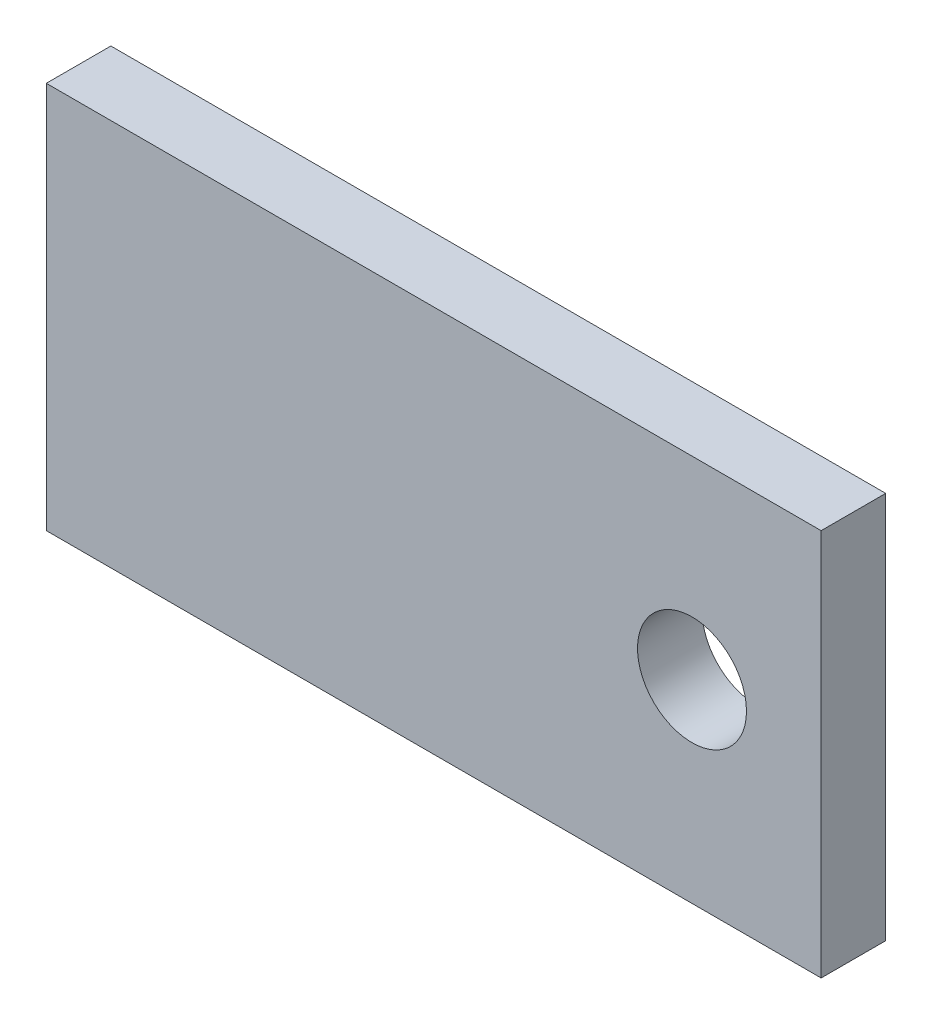
ISO-10303-21;
HEADER;
FILE_DESCRIPTION(('STEP AP214'),'2;1');
FILE_NAME('part.step','',(''),(''),'','','');
FILE_SCHEMA(('AUTOMOTIVE_DESIGN { 1 0 10303 214 1 1 1 1 }'));
ENDSEC;
DATA;
#1=APPLICATION_CONTEXT('core data for automotive mechanical design processes');
#2=APPLICATION_PROTOCOL_DEFINITION('international standard','automotive_design',2000,#1);
#3=PRODUCT_CONTEXT('',#1,'mechanical');
#4=PRODUCT('Part','Part','',(#3));
#5=PRODUCT_RELATED_PRODUCT_CATEGORY('part','',(#4));
#6=PRODUCT_DEFINITION_FORMATION('','',#4);
#7=PRODUCT_DEFINITION_CONTEXT('part definition',#1,'design');
#8=PRODUCT_DEFINITION('design','',#6,#7);
#9=PRODUCT_DEFINITION_SHAPE('','',#8);
#10=(LENGTH_UNIT() NAMED_UNIT(*) SI_UNIT(.MILLI.,.METRE.));
#11=(NAMED_UNIT(*) PLANE_ANGLE_UNIT() SI_UNIT($,.RADIAN.));
#12=(NAMED_UNIT(*) SI_UNIT($,.STERADIAN.) SOLID_ANGLE_UNIT());
#13=UNCERTAINTY_MEASURE_WITH_UNIT(LENGTH_MEASURE(1.E-05),#10,'distance_accuracy_value','');
#14=(GEOMETRIC_REPRESENTATION_CONTEXT(3) GLOBAL_UNCERTAINTY_ASSIGNED_CONTEXT((#13)) GLOBAL_UNIT_ASSIGNED_CONTEXT((#10,
#11,#12)) REPRESENTATION_CONTEXT('',''));
#15=CARTESIAN_POINT('',(0.,0.,0.));
#16=DIRECTION('',(0.,0.,1.));
#17=DIRECTION('',(1.,0.,0.));
#18=AXIS2_PLACEMENT_3D('',#15,#16,#17);
#19=CARTESIAN_POINT('',(38.1,-19.05,3.175));
#20=DIRECTION('',(-1.,0.,0.));
#21=DIRECTION('',(0.,0.,1.));
#22=AXIS2_PLACEMENT_3D('',#19,#20,#21);
#23=PLANE('',#22);
#24=DIRECTION('',(0.,1.,0.));
#25=VECTOR('',#24,1.);
#26=CARTESIAN_POINT('',(38.1,-19.05,-3.175));
#27=LINE('',#26,#25);
#28=CARTESIAN_POINT('',(38.1,-19.05,-3.175));
#29=VERTEX_POINT('',#28);
#30=CARTESIAN_POINT('',(38.1,19.05,-3.175));
#31=VERTEX_POINT('',#30);
#32=EDGE_CURVE('E102',#29,#31,#27,.T.);
#33=ORIENTED_EDGE('',*,*,#32,.T.);
#34=DIRECTION('',(0.,0.,-1.));
#35=VECTOR('',#34,1.);
#36=CARTESIAN_POINT('',(38.1,19.05,3.175));
#37=LINE('',#36,#35);
#38=CARTESIAN_POINT('',(38.1,19.05,3.175));
#39=VERTEX_POINT('',#38);
#40=EDGE_CURVE('E11',#39,#31,#37,.T.);
#41=ORIENTED_EDGE('',*,*,#40,.F.);
#42=DIRECTION('',(0.,1.,0.));
#43=VECTOR('',#42,1.);
#44=CARTESIAN_POINT('',(38.1,-19.05,3.175));
#45=LINE('',#44,#43);
#46=CARTESIAN_POINT('',(38.1,-19.05,3.175));
#47=VERTEX_POINT('',#46);
#48=EDGE_CURVE('E90',#47,#39,#45,.T.);
#49=ORIENTED_EDGE('',*,*,#48,.F.);
#50=DIRECTION('',(0.,0.,-1.));
#51=VECTOR('',#50,1.);
#52=CARTESIAN_POINT('',(38.1,-19.05,3.175));
#53=LINE('',#52,#51);
#54=EDGE_CURVE('E98',#47,#29,#53,.T.);
#55=ORIENTED_EDGE('',*,*,#54,.T.);
#56=EDGE_LOOP('',(#33,#41,#49,#55));
#57=FACE_BOUND('',#56,.T.);
#58=ADVANCED_FACE('F39',(#57),#23,.F.);
#59=CARTESIAN_POINT('',(-38.1,19.05,3.175));
#60=DIRECTION('',(0.,-1.,0.));
#61=DIRECTION('',(0.,0.,-1.));
#62=AXIS2_PLACEMENT_3D('',#59,#60,#61);
#63=PLANE('',#62);
#64=DIRECTION('',(-1.,0.,0.));
#65=VECTOR('',#64,1.);
#66=CARTESIAN_POINT('',(-38.1,19.05,-3.175));
#67=LINE('',#66,#65);
#68=CARTESIAN_POINT('',(-38.1,19.05,-3.175));
#69=VERTEX_POINT('',#68);
#70=EDGE_CURVE('E94',#31,#69,#67,.T.);
#71=ORIENTED_EDGE('',*,*,#70,.T.);
#72=DIRECTION('',(0.,0.,-1.));
#73=VECTOR('',#72,1.);
#74=CARTESIAN_POINT('',(-38.1,19.05,3.175));
#75=LINE('',#74,#73);
#76=CARTESIAN_POINT('',(-38.1,19.05,3.175));
#77=VERTEX_POINT('',#76);
#78=EDGE_CURVE('E47',#77,#69,#75,.T.);
#79=ORIENTED_EDGE('',*,*,#78,.F.);
#80=DIRECTION('',(-1.,0.,0.));
#81=VECTOR('',#80,1.);
#82=CARTESIAN_POINT('',(-38.1,19.05,3.175));
#83=LINE('',#82,#81);
#84=EDGE_CURVE('E85',#39,#77,#83,.T.);
#85=ORIENTED_EDGE('',*,*,#84,.F.);
#86=ORIENTED_EDGE('',*,*,#40,.T.);
#87=EDGE_LOOP('',(#71,#79,#85,#86));
#88=FACE_BOUND('',#87,.T.);
#89=ADVANCED_FACE('F93',(#88),#63,.F.);
#90=CARTESIAN_POINT('',(-38.1,-19.05,3.175));
#91=DIRECTION('',(1.,0.,0.));
#92=DIRECTION('',(0.,0.,-1.));
#93=AXIS2_PLACEMENT_3D('',#90,#91,#92);
#94=PLANE('',#93);
#95=DIRECTION('',(0.,-1.,0.));
#96=VECTOR('',#95,1.);
#97=CARTESIAN_POINT('',(-38.1,-19.05,-3.175));
#98=LINE('',#97,#96);
#99=CARTESIAN_POINT('',(-38.1,-19.05,-3.175));
#100=VERTEX_POINT('',#99);
#101=EDGE_CURVE('E72',#69,#100,#98,.T.);
#102=ORIENTED_EDGE('',*,*,#101,.T.);
#103=DIRECTION('',(0.,0.,-1.));
#104=VECTOR('',#103,1.);
#105=CARTESIAN_POINT('',(-38.1,-19.05,3.175));
#106=LINE('',#105,#104);
#107=CARTESIAN_POINT('',(-38.1,-19.05,3.175));
#108=VERTEX_POINT('',#107);
#109=EDGE_CURVE('E95',#108,#100,#106,.T.);
#110=ORIENTED_EDGE('',*,*,#109,.F.);
#111=DIRECTION('',(0.,-1.,0.));
#112=VECTOR('',#111,1.);
#113=CARTESIAN_POINT('',(-38.1,-19.05,3.175));
#114=LINE('',#113,#112);
#115=EDGE_CURVE('E88',#77,#108,#114,.T.);
#116=ORIENTED_EDGE('',*,*,#115,.F.);
#117=ORIENTED_EDGE('',*,*,#78,.T.);
#118=EDGE_LOOP('',(#102,#110,#116,#117));
#119=FACE_BOUND('',#118,.T.);
#120=ADVANCED_FACE('F96',(#119),#94,.F.);
#121=CARTESIAN_POINT('',(-38.1,-19.05,3.175));
#122=DIRECTION('',(0.,1.,0.));
#123=DIRECTION('',(0.,0.,1.));
#124=AXIS2_PLACEMENT_3D('',#121,#122,#123);
#125=PLANE('',#124);
#126=DIRECTION('',(1.,0.,0.));
#127=VECTOR('',#126,1.);
#128=CARTESIAN_POINT('',(-38.1,-19.05,-3.175));
#129=LINE('',#128,#127);
#130=EDGE_CURVE('E78',#100,#29,#129,.T.);
#131=ORIENTED_EDGE('',*,*,#130,.T.);
#132=ORIENTED_EDGE('',*,*,#54,.F.);
#133=DIRECTION('',(1.,0.,0.));
#134=VECTOR('',#133,1.);
#135=CARTESIAN_POINT('',(-38.1,-19.05,3.175));
#136=LINE('',#135,#134);
#137=EDGE_CURVE('E55',#108,#47,#136,.T.);
#138=ORIENTED_EDGE('',*,*,#137,.F.);
#139=ORIENTED_EDGE('',*,*,#109,.T.);
#140=EDGE_LOOP('',(#131,#132,#138,#139));
#141=FACE_BOUND('',#140,.T.);
#142=ADVANCED_FACE('F110',(#141),#125,.F.);
#143=CARTESIAN_POINT('',(38.1,19.05,3.175));
#144=DIRECTION('',(0.,0.,-1.));
#145=DIRECTION('',(-1.,0.,0.));
#146=AXIS2_PLACEMENT_3D('',#143,#144,#145);
#147=PLANE('',#146);
#148=CARTESIAN_POINT('',(25.4,0.,3.175));
#149=DIRECTION('',(0.,0.,1.));
#150=DIRECTION('',(1.,0.,0.));
#151=AXIS2_PLACEMENT_3D('',#148,#149,#150);
#152=CIRCLE('',#151,5.357876);
#153=CARTESIAN_POINT('',(30.757876,0.,3.175));
#154=VERTEX_POINT('',#153);
#155=EDGE_CURVE('E118',#154,#154,#152,.T.);
#156=ORIENTED_EDGE('',*,*,#155,.F.);
#157=EDGE_LOOP('',(#156));
#158=FACE_BOUND('',#157,.T.);
#159=ORIENTED_EDGE('',*,*,#48,.T.);
#160=ORIENTED_EDGE('',*,*,#84,.T.);
#161=ORIENTED_EDGE('',*,*,#115,.T.);
#162=ORIENTED_EDGE('',*,*,#137,.T.);
#163=EDGE_LOOP('',(#159,#160,#161,#162));
#164=FACE_BOUND('',#163,.T.);
#165=ADVANCED_FACE('F86',(#158,#164),#147,.F.);
#166=CARTESIAN_POINT('',(38.1,19.05,-3.175));
#167=DIRECTION('',(0.,0.,-1.));
#168=DIRECTION('',(-1.,0.,0.));
#169=AXIS2_PLACEMENT_3D('',#166,#167,#168);
#170=PLANE('',#169);
#171=CARTESIAN_POINT('',(25.4,0.,-3.175));
#172=DIRECTION('',(0.,0.,1.));
#173=DIRECTION('',(1.,0.,0.));
#174=AXIS2_PLACEMENT_3D('',#171,#172,#173);
#175=CIRCLE('',#174,5.357876);
#176=CARTESIAN_POINT('',(30.757876,0.,-3.175));
#177=VERTEX_POINT('',#176);
#178=EDGE_CURVE('E105',#177,#177,#175,.T.);
#179=ORIENTED_EDGE('',*,*,#178,.T.);
#180=EDGE_LOOP('',(#179));
#181=FACE_BOUND('',#180,.T.);
#182=ORIENTED_EDGE('',*,*,#32,.F.);
#183=ORIENTED_EDGE('',*,*,#130,.F.);
#184=ORIENTED_EDGE('',*,*,#101,.F.);
#185=ORIENTED_EDGE('',*,*,#70,.F.);
#186=EDGE_LOOP('',(#182,#183,#184,#185));
#187=FACE_BOUND('',#186,.T.);
#188=ADVANCED_FACE('F113',(#181,#187),#170,.T.);
#189=CARTESIAN_POINT('',(25.4,0.,3.175));
#190=DIRECTION('',(0.,0.,1.));
#191=DIRECTION('',(1.,0.,0.));
#192=AXIS2_PLACEMENT_3D('',#189,#190,#191);
#193=CYLINDRICAL_SURFACE('',#192,5.357876);
#194=ORIENTED_EDGE('',*,*,#178,.F.);
#195=EDGE_LOOP('',(#194));
#196=FACE_BOUND('',#195,.T.);
#197=ORIENTED_EDGE('',*,*,#155,.T.);
#198=EDGE_LOOP('',(#197));
#199=FACE_BOUND('',#198,.T.);
#200=ADVANCED_FACE('F122',(#196,#199),#193,.F.);
#201=CLOSED_SHELL('',(#58,#89,#120,#142,#165,#188,#200));
#202=MANIFOLD_SOLID_BREP('B2',#201);
#203=ADVANCED_BREP_SHAPE_REPRESENTATION('',(#18,#202),#14);
#204=SHAPE_DEFINITION_REPRESENTATION(#9,#203);
ENDSEC;
END-ISO-10303-21;
